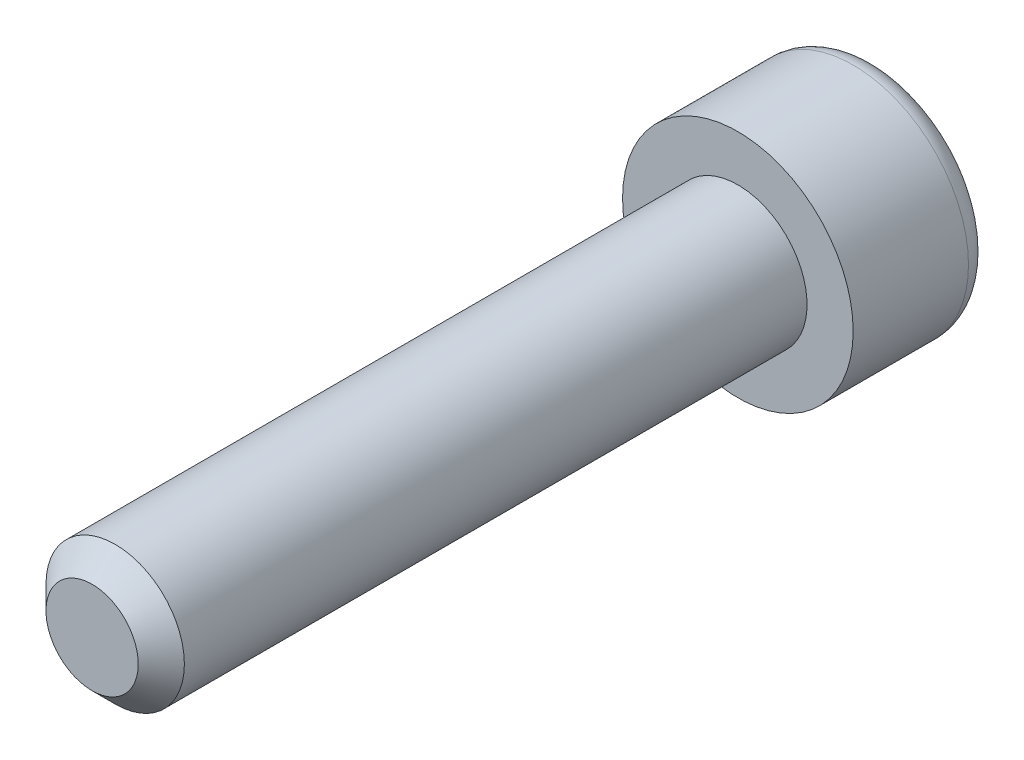
ISO-10303-21;
HEADER;
FILE_DESCRIPTION(('STEP AP214'),'2;1');
FILE_NAME('part.step','',(''),(''),'','','');
FILE_SCHEMA(('AUTOMOTIVE_DESIGN { 1 0 10303 214 1 1 1 1 }'));
ENDSEC;
DATA;
#1=APPLICATION_CONTEXT('core data for automotive mechanical design processes');
#2=APPLICATION_PROTOCOL_DEFINITION('international standard','automotive_design',2000,#1);
#3=PRODUCT_CONTEXT('',#1,'mechanical');
#4=PRODUCT('Part','Part','',(#3));
#5=PRODUCT_RELATED_PRODUCT_CATEGORY('part','',(#4));
#6=PRODUCT_DEFINITION_FORMATION('','',#4);
#7=PRODUCT_DEFINITION_CONTEXT('part definition',#1,'design');
#8=PRODUCT_DEFINITION('design','',#6,#7);
#9=PRODUCT_DEFINITION_SHAPE('','',#8);
#10=(LENGTH_UNIT() NAMED_UNIT(*) SI_UNIT(.MILLI.,.METRE.));
#11=(NAMED_UNIT(*) PLANE_ANGLE_UNIT() SI_UNIT($,.RADIAN.));
#12=(NAMED_UNIT(*) SI_UNIT($,.STERADIAN.) SOLID_ANGLE_UNIT());
#13=UNCERTAINTY_MEASURE_WITH_UNIT(LENGTH_MEASURE(1.E-05),#10,'distance_accuracy_value','');
#14=(GEOMETRIC_REPRESENTATION_CONTEXT(3) GLOBAL_UNCERTAINTY_ASSIGNED_CONTEXT((#13)) GLOBAL_UNIT_ASSIGNED_CONTEXT((#10,
#11,#12)) REPRESENTATION_CONTEXT('',''));
#15=CARTESIAN_POINT('',(0.,0.,0.));
#16=DIRECTION('',(0.,0.,1.));
#17=DIRECTION('',(1.,0.,0.));
#18=AXIS2_PLACEMENT_3D('',#15,#16,#17);
#19=CARTESIAN_POINT('',(0.,0.,14.));
#20=DIRECTION('',(0.,0.,-1.));
#21=DIRECTION('',(-1.,0.,0.));
#22=AXIS2_PLACEMENT_3D('',#19,#20,#21);
#23=CYLINDRICAL_SURFACE('',#22,1.5);
#24=CARTESIAN_POINT('',(0.,0.,13.5));
#25=DIRECTION('',(0.,0.,1.));
#26=DIRECTION('',(1.,0.,0.));
#27=AXIS2_PLACEMENT_3D('',#24,#25,#26);
#28=CIRCLE('',#27,1.5);
#29=CARTESIAN_POINT('',(1.5,0.,13.5));
#30=VERTEX_POINT('',#29);
#31=EDGE_CURVE('E151',#30,#30,#28,.F.);
#32=ORIENTED_EDGE('',*,*,#31,.T.);
#33=EDGE_LOOP('',(#32));
#34=FACE_BOUND('',#33,.T.);
#35=CARTESIAN_POINT('',(0.,0.,0.));
#36=DIRECTION('',(0.,0.,-1.));
#37=DIRECTION('',(-1.,0.,0.));
#38=AXIS2_PLACEMENT_3D('',#35,#36,#37);
#39=CIRCLE('',#38,1.5);
#40=CARTESIAN_POINT('',(-1.5,0.,0.));
#41=VERTEX_POINT('',#40);
#42=EDGE_CURVE('E145',#41,#41,#39,.T.);
#43=ORIENTED_EDGE('',*,*,#42,.F.);
#44=EDGE_LOOP('',(#43));
#45=FACE_BOUND('',#44,.T.);
#46=ADVANCED_FACE('F34',(#34,#45),#23,.T.);
#47=CARTESIAN_POINT('',(0.,0.,14.));
#48=DIRECTION('',(0.,0.,1.));
#49=DIRECTION('',(1.,0.,0.));
#50=AXIS2_PLACEMENT_3D('',#47,#48,#49);
#51=PLANE('',#50);
#52=CARTESIAN_POINT('',(0.,0.,14.));
#53=DIRECTION('',(0.,0.,1.));
#54=DIRECTION('',(1.,0.,0.));
#55=AXIS2_PLACEMENT_3D('',#52,#53,#54);
#56=CIRCLE('',#55,0.999999999999999);
#57=CARTESIAN_POINT('',(0.999999999999999,0.,14.));
#58=VERTEX_POINT('',#57);
#59=EDGE_CURVE('E148',#58,#58,#56,.T.);
#60=ORIENTED_EDGE('',*,*,#59,.T.);
#61=EDGE_LOOP('',(#60));
#62=FACE_BOUND('',#61,.T.);
#63=ADVANCED_FACE('F172',(#62),#51,.T.);
#64=CARTESIAN_POINT('',(0.,0.,14.));
#65=DIRECTION('',(0.,0.,-1.));
#66=DIRECTION('',(-1.,0.,0.));
#67=AXIS2_PLACEMENT_3D('',#64,#65,#66);
#68=CONICAL_SURFACE('',#67,0.999999999999999,0.785398163397447);
#69=ORIENTED_EDGE('',*,*,#31,.F.);
#70=EDGE_LOOP('',(#69));
#71=FACE_BOUND('',#70,.T.);
#72=ORIENTED_EDGE('',*,*,#59,.F.);
#73=EDGE_LOOP('',(#72));
#74=FACE_BOUND('',#73,.T.);
#75=ADVANCED_FACE('F177',(#71,#74),#68,.T.);
#76=CARTESIAN_POINT('',(0.,0.,0.));
#77=DIRECTION('',(0.,0.,-1.));
#78=DIRECTION('',(-1.,0.,0.));
#79=AXIS2_PLACEMENT_3D('',#76,#77,#78);
#80=PLANE('',#79);
#81=CARTESIAN_POINT('',(0.,0.,0.));
#82=DIRECTION('',(0.,0.,-1.));
#83=DIRECTION('',(-1.,0.,0.));
#84=AXIS2_PLACEMENT_3D('',#81,#82,#83);
#85=CIRCLE('',#84,2.5);
#86=CARTESIAN_POINT('',(-2.5,0.,0.));
#87=VERTEX_POINT('',#86);
#88=EDGE_CURVE('E136',#87,#87,#85,.T.);
#89=ORIENTED_EDGE('',*,*,#88,.F.);
#90=EDGE_LOOP('',(#89));
#91=FACE_BOUND('',#90,.T.);
#92=ORIENTED_EDGE('',*,*,#42,.T.);
#93=EDGE_LOOP('',(#92));
#94=FACE_BOUND('',#93,.T.);
#95=ADVANCED_FACE('F183',(#91,#94),#80,.F.);
#96=CARTESIAN_POINT('',(0.,0.,-3.));
#97=DIRECTION('',(0.,0.,1.));
#98=DIRECTION('',(1.,0.,0.));
#99=AXIS2_PLACEMENT_3D('',#96,#97,#98);
#100=CYLINDRICAL_SURFACE('',#99,2.5);
#101=CARTESIAN_POINT('',(0.,0.,-2.5));
#102=DIRECTION('',(0.,0.,-1.));
#103=DIRECTION('',(-1.,0.,0.));
#104=AXIS2_PLACEMENT_3D('',#101,#102,#103);
#105=CIRCLE('',#104,2.5);
#106=CARTESIAN_POINT('',(-2.5,0.,-2.5));
#107=VERTEX_POINT('',#106);
#108=EDGE_CURVE('E11',#107,#107,#105,.F.);
#109=ORIENTED_EDGE('',*,*,#108,.T.);
#110=EDGE_LOOP('',(#109));
#111=FACE_BOUND('',#110,.T.);
#112=ORIENTED_EDGE('',*,*,#88,.T.);
#113=EDGE_LOOP('',(#112));
#114=FACE_BOUND('',#113,.T.);
#115=ADVANCED_FACE('F167',(#111,#114),#100,.T.);
#116=CARTESIAN_POINT('',(0.,0.,-3.));
#117=DIRECTION('',(0.,0.,-1.));
#118=DIRECTION('',(-1.,0.,0.));
#119=AXIS2_PLACEMENT_3D('',#116,#117,#118);
#120=PLANE('',#119);
#121=DIRECTION('',(-0.5,0.866025403784439,0.));
#122=VECTOR('',#121,1.);
#123=CARTESIAN_POINT('',(-0.866025403784439,-1.5,-3.));
#124=LINE('',#123,#122);
#125=CARTESIAN_POINT('',(-0.866025403784439,-1.5,-3.));
#126=VERTEX_POINT('',#125);
#127=CARTESIAN_POINT('',(-1.73205080756888,0.,-3.));
#128=VERTEX_POINT('',#127);
#129=EDGE_CURVE('E48',#126,#128,#124,.T.);
#130=ORIENTED_EDGE('',*,*,#129,.F.);
#131=DIRECTION('',(-1.,0.,0.));
#132=VECTOR('',#131,1.);
#133=CARTESIAN_POINT('',(0.866025403784439,-1.5,-3.));
#134=LINE('',#133,#132);
#135=CARTESIAN_POINT('',(0.866025403784439,-1.5,-3.));
#136=VERTEX_POINT('',#135);
#137=EDGE_CURVE('E118',#136,#126,#134,.T.);
#138=ORIENTED_EDGE('',*,*,#137,.F.);
#139=DIRECTION('',(-0.5,-0.866025403784439,0.));
#140=VECTOR('',#139,1.);
#141=CARTESIAN_POINT('',(1.73205080756888,0.,-3.));
#142=LINE('',#141,#140);
#143=CARTESIAN_POINT('',(1.73205080756888,0.,-3.));
#144=VERTEX_POINT('',#143);
#145=EDGE_CURVE('E112',#144,#136,#142,.T.);
#146=ORIENTED_EDGE('',*,*,#145,.F.);
#147=DIRECTION('',(0.5,-0.866025403784439,0.));
#148=VECTOR('',#147,1.);
#149=CARTESIAN_POINT('',(0.866025403784439,1.5,-3.));
#150=LINE('',#149,#148);
#151=CARTESIAN_POINT('',(0.866025403784439,1.5,-3.));
#152=VERTEX_POINT('',#151);
#153=EDGE_CURVE('E110',#152,#144,#150,.T.);
#154=ORIENTED_EDGE('',*,*,#153,.F.);
#155=DIRECTION('',(1.,0.,0.));
#156=VECTOR('',#155,1.);
#157=CARTESIAN_POINT('',(-0.866025403784438,1.5,-3.));
#158=LINE('',#157,#156);
#159=CARTESIAN_POINT('',(-0.866025403784438,1.5,-3.));
#160=VERTEX_POINT('',#159);
#161=EDGE_CURVE('E91',#160,#152,#158,.T.);
#162=ORIENTED_EDGE('',*,*,#161,.F.);
#163=DIRECTION('',(0.5,0.866025403784438,0.));
#164=VECTOR('',#163,1.);
#165=CARTESIAN_POINT('',(-1.73205080756888,0.,-3.));
#166=LINE('',#165,#164);
#167=EDGE_CURVE('E102',#128,#160,#166,.T.);
#168=ORIENTED_EDGE('',*,*,#167,.F.);
#169=EDGE_LOOP('',(#130,#138,#146,#154,#162,#168));
#170=FACE_BOUND('',#169,.T.);
#171=CARTESIAN_POINT('',(0.,0.,-3.));
#172=DIRECTION('',(0.,0.,-1.));
#173=DIRECTION('',(-1.,0.,0.));
#174=AXIS2_PLACEMENT_3D('',#171,#172,#173);
#175=CIRCLE('',#174,2.);
#176=CARTESIAN_POINT('',(-2.,0.,-3.));
#177=VERTEX_POINT('',#176);
#178=EDGE_CURVE('E41',#177,#177,#175,.T.);
#179=ORIENTED_EDGE('',*,*,#178,.T.);
#180=EDGE_LOOP('',(#179));
#181=FACE_BOUND('',#180,.T.);
#182=ADVANCED_FACE('F106',(#170,#181),#120,.T.);
#183=CARTESIAN_POINT('',(0.,0.,-2.5));
#184=DIRECTION('',(0.,0.,-1.));
#185=DIRECTION('',(-1.,0.,0.));
#186=AXIS2_PLACEMENT_3D('',#183,#184,#185);
#187=TOROIDAL_SURFACE('',#186,2.,0.5);
#188=ORIENTED_EDGE('',*,*,#108,.F.);
#189=EDGE_LOOP('',(#188));
#190=FACE_BOUND('',#189,.T.);
#191=ORIENTED_EDGE('',*,*,#178,.F.);
#192=EDGE_LOOP('',(#191));
#193=FACE_BOUND('',#192,.T.);
#194=ADVANCED_FACE('F156',(#190,#193),#187,.T.);
#195=CARTESIAN_POINT('',(-0.866025403784439,-1.5,-0.5));
#196=DIRECTION('',(-0.866025403784439,-0.5,0.));
#197=DIRECTION('',(0.5,-0.866025403784439,0.));
#198=AXIS2_PLACEMENT_3D('',#195,#196,#197);
#199=PLANE('',#198);
#200=ORIENTED_EDGE('',*,*,#129,.T.);
#201=DIRECTION('',(0.,0.,-1.));
#202=VECTOR('',#201,1.);
#203=CARTESIAN_POINT('',(-1.73205080756888,0.,-0.5));
#204=LINE('',#203,#202);
#205=CARTESIAN_POINT('',(-1.73205080756888,0.,-0.5));
#206=VERTEX_POINT('',#205);
#207=EDGE_CURVE('E99',#206,#128,#204,.T.);
#208=ORIENTED_EDGE('',*,*,#207,.F.);
#209=DIRECTION('',(-0.5,0.866025403784439,0.));
#210=VECTOR('',#209,1.);
#211=CARTESIAN_POINT('',(-0.866025403784439,-1.5,-0.5));
#212=LINE('',#211,#210);
#213=CARTESIAN_POINT('',(-0.866025403784439,-1.5,-0.5));
#214=VERTEX_POINT('',#213);
#215=EDGE_CURVE('E120',#214,#206,#212,.T.);
#216=ORIENTED_EDGE('',*,*,#215,.F.);
#217=DIRECTION('',(0.,0.,-1.));
#218=VECTOR('',#217,1.);
#219=CARTESIAN_POINT('',(-0.866025403784439,-1.5,-0.5));
#220=LINE('',#219,#218);
#221=EDGE_CURVE('E55',#214,#126,#220,.T.);
#222=ORIENTED_EDGE('',*,*,#221,.T.);
#223=EDGE_LOOP('',(#200,#208,#216,#222));
#224=FACE_BOUND('',#223,.T.);
#225=ADVANCED_FACE('F158',(#224),#199,.F.);
#226=CARTESIAN_POINT('',(0.866025403784439,-1.5,-0.5));
#227=DIRECTION('',(0.,-1.,0.));
#228=DIRECTION('',(0.,0.,-1.));
#229=AXIS2_PLACEMENT_3D('',#226,#227,#228);
#230=PLANE('',#229);
#231=ORIENTED_EDGE('',*,*,#137,.T.);
#232=ORIENTED_EDGE('',*,*,#221,.F.);
#233=DIRECTION('',(-1.,0.,0.));
#234=VECTOR('',#233,1.);
#235=CARTESIAN_POINT('',(0.866025403784439,-1.5,-0.5));
#236=LINE('',#235,#234);
#237=CARTESIAN_POINT('',(0.866025403784439,-1.5,-0.5));
#238=VERTEX_POINT('',#237);
#239=EDGE_CURVE('E132',#238,#214,#236,.T.);
#240=ORIENTED_EDGE('',*,*,#239,.F.);
#241=DIRECTION('',(0.,0.,-1.));
#242=VECTOR('',#241,1.);
#243=CARTESIAN_POINT('',(0.866025403784439,-1.5,-0.5));
#244=LINE('',#243,#242);
#245=EDGE_CURVE('E137',#238,#136,#244,.T.);
#246=ORIENTED_EDGE('',*,*,#245,.T.);
#247=EDGE_LOOP('',(#231,#232,#240,#246));
#248=FACE_BOUND('',#247,.T.);
#249=ADVANCED_FACE('F165',(#248),#230,.F.);
#250=CARTESIAN_POINT('',(1.73205080756888,0.,-0.5));
#251=DIRECTION('',(0.866025403784439,-0.5,0.));
#252=DIRECTION('',(0.5,0.866025403784439,0.));
#253=AXIS2_PLACEMENT_3D('',#250,#251,#252);
#254=PLANE('',#253);
#255=ORIENTED_EDGE('',*,*,#145,.T.);
#256=ORIENTED_EDGE('',*,*,#245,.F.);
#257=DIRECTION('',(-0.5,-0.866025403784439,0.));
#258=VECTOR('',#257,1.);
#259=CARTESIAN_POINT('',(1.73205080756888,0.,-0.5));
#260=LINE('',#259,#258);
#261=CARTESIAN_POINT('',(1.73205080756888,0.,-0.5));
#262=VERTEX_POINT('',#261);
#263=EDGE_CURVE('E129',#262,#238,#260,.T.);
#264=ORIENTED_EDGE('',*,*,#263,.F.);
#265=DIRECTION('',(0.,0.,-1.));
#266=VECTOR('',#265,1.);
#267=CARTESIAN_POINT('',(1.73205080756888,0.,-0.5));
#268=LINE('',#267,#266);
#269=EDGE_CURVE('E139',#262,#144,#268,.T.);
#270=ORIENTED_EDGE('',*,*,#269,.T.);
#271=EDGE_LOOP('',(#255,#256,#264,#270));
#272=FACE_BOUND('',#271,.T.);
#273=ADVANCED_FACE('F243',(#272),#254,.F.);
#274=CARTESIAN_POINT('',(0.866025403784439,1.5,-0.5));
#275=DIRECTION('',(0.866025403784439,0.5,0.));
#276=DIRECTION('',(-0.5,0.866025403784439,0.));
#277=AXIS2_PLACEMENT_3D('',#274,#275,#276);
#278=PLANE('',#277);
#279=ORIENTED_EDGE('',*,*,#153,.T.);
#280=ORIENTED_EDGE('',*,*,#269,.F.);
#281=DIRECTION('',(0.5,-0.866025403784439,0.));
#282=VECTOR('',#281,1.);
#283=CARTESIAN_POINT('',(0.866025403784439,1.5,-0.5));
#284=LINE('',#283,#282);
#285=CARTESIAN_POINT('',(0.866025403784439,1.5,-0.5));
#286=VERTEX_POINT('',#285);
#287=EDGE_CURVE('E126',#286,#262,#284,.T.);
#288=ORIENTED_EDGE('',*,*,#287,.F.);
#289=DIRECTION('',(0.,0.,-1.));
#290=VECTOR('',#289,1.);
#291=CARTESIAN_POINT('',(0.866025403784439,1.5,-0.5));
#292=LINE('',#291,#290);
#293=EDGE_CURVE('E98',#286,#152,#292,.T.);
#294=ORIENTED_EDGE('',*,*,#293,.T.);
#295=EDGE_LOOP('',(#279,#280,#288,#294));
#296=FACE_BOUND('',#295,.T.);
#297=ADVANCED_FACE('F251',(#296),#278,.F.);
#298=CARTESIAN_POINT('',(-0.866025403784438,1.5,-0.5));
#299=DIRECTION('',(0.,1.,0.));
#300=DIRECTION('',(-1.,0.,0.));
#301=AXIS2_PLACEMENT_3D('',#298,#299,#300);
#302=PLANE('',#301);
#303=ORIENTED_EDGE('',*,*,#161,.T.);
#304=ORIENTED_EDGE('',*,*,#293,.F.);
#305=DIRECTION('',(1.,0.,0.));
#306=VECTOR('',#305,1.);
#307=CARTESIAN_POINT('',(-0.866025403784438,1.5,-0.5));
#308=LINE('',#307,#306);
#309=CARTESIAN_POINT('',(-0.866025403784438,1.5,-0.5));
#310=VERTEX_POINT('',#309);
#311=EDGE_CURVE('E94',#310,#286,#308,.T.);
#312=ORIENTED_EDGE('',*,*,#311,.F.);
#313=DIRECTION('',(0.,0.,-1.));
#314=VECTOR('',#313,1.);
#315=CARTESIAN_POINT('',(-0.866025403784438,1.5,-0.5));
#316=LINE('',#315,#314);
#317=EDGE_CURVE('E87',#310,#160,#316,.T.);
#318=ORIENTED_EDGE('',*,*,#317,.T.);
#319=EDGE_LOOP('',(#303,#304,#312,#318));
#320=FACE_BOUND('',#319,.T.);
#321=ADVANCED_FACE('F89',(#320),#302,.F.);
#322=CARTESIAN_POINT('',(-1.73205080756888,0.,-0.5));
#323=DIRECTION('',(-0.866025403784439,0.5,0.));
#324=DIRECTION('',(-0.5,-0.866025403784439,0.));
#325=AXIS2_PLACEMENT_3D('',#322,#323,#324);
#326=PLANE('',#325);
#327=ORIENTED_EDGE('',*,*,#167,.T.);
#328=ORIENTED_EDGE('',*,*,#317,.F.);
#329=DIRECTION('',(0.5,0.866025403784438,0.));
#330=VECTOR('',#329,1.);
#331=CARTESIAN_POINT('',(-1.73205080756888,0.,-0.5));
#332=LINE('',#331,#330);
#333=EDGE_CURVE('E123',#206,#310,#332,.T.);
#334=ORIENTED_EDGE('',*,*,#333,.F.);
#335=ORIENTED_EDGE('',*,*,#207,.T.);
#336=EDGE_LOOP('',(#327,#328,#334,#335));
#337=FACE_BOUND('',#336,.T.);
#338=ADVANCED_FACE('F103',(#337),#326,.F.);
#339=CARTESIAN_POINT('',(-0.866025403784439,-1.5,-0.5));
#340=DIRECTION('',(0.,0.,1.));
#341=DIRECTION('',(1.,0.,0.));
#342=AXIS2_PLACEMENT_3D('',#339,#340,#341);
#343=PLANE('',#342);
#344=ORIENTED_EDGE('',*,*,#215,.T.);
#345=ORIENTED_EDGE('',*,*,#333,.T.);
#346=ORIENTED_EDGE('',*,*,#311,.T.);
#347=ORIENTED_EDGE('',*,*,#287,.T.);
#348=ORIENTED_EDGE('',*,*,#263,.T.);
#349=ORIENTED_EDGE('',*,*,#239,.T.);
#350=EDGE_LOOP('',(#344,#345,#346,#347,#348,#349));
#351=FACE_BOUND('',#350,.T.);
#352=ADVANCED_FACE('F275',(#351),#343,.F.);
#353=CLOSED_SHELL('',(#46,#63,#75,#95,#115,#182,#194,#225,#249,#273,#297,#321,#338,#352));
#354=MANIFOLD_SOLID_BREP('B2',#353);
#355=ADVANCED_BREP_SHAPE_REPRESENTATION('',(#18,#354),#14);
#356=SHAPE_DEFINITION_REPRESENTATION(#9,#355);
ENDSEC;
END-ISO-10303-21;
